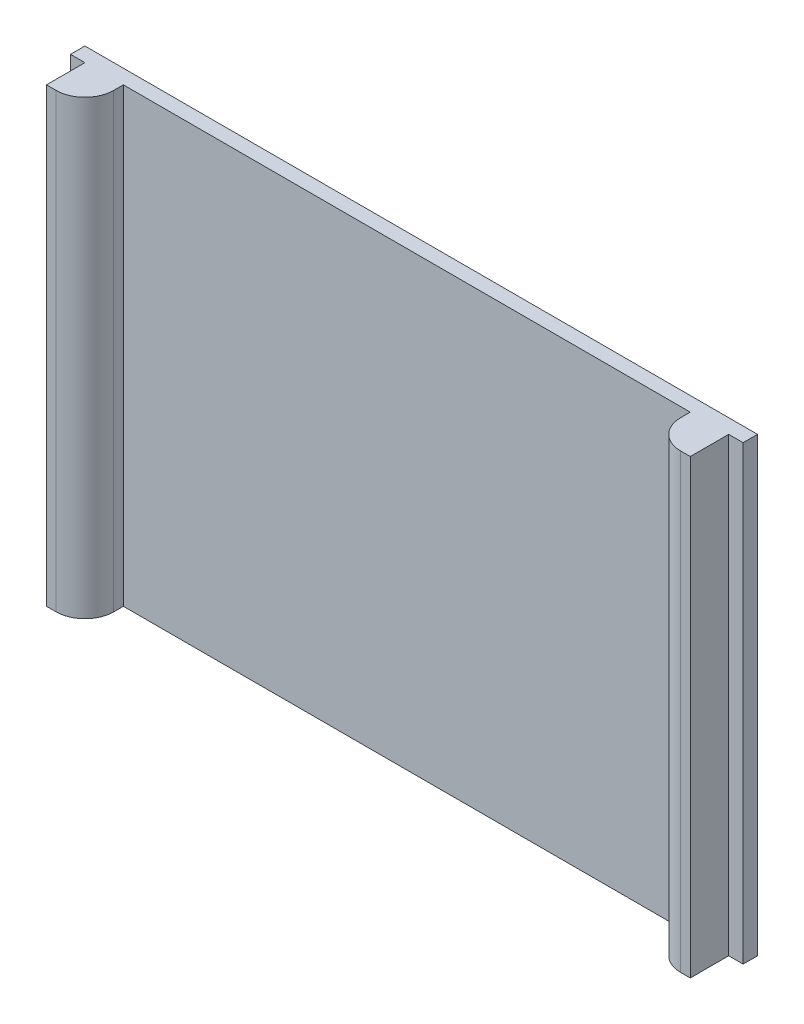
ISO-10303-21;
HEADER;
FILE_DESCRIPTION(('STEP AP214'),'2;1');
FILE_NAME('part.step','',(''),(''),'','','');
FILE_SCHEMA(('AUTOMOTIVE_DESIGN { 1 0 10303 214 1 1 1 1 }'));
ENDSEC;
DATA;
#1=APPLICATION_CONTEXT('core data for automotive mechanical design processes');
#2=APPLICATION_PROTOCOL_DEFINITION('international standard','automotive_design',2000,#1);
#3=PRODUCT_CONTEXT('',#1,'mechanical');
#4=PRODUCT('Part','Part','',(#3));
#5=PRODUCT_RELATED_PRODUCT_CATEGORY('part','',(#4));
#6=PRODUCT_DEFINITION_FORMATION('','',#4);
#7=PRODUCT_DEFINITION_CONTEXT('part definition',#1,'design');
#8=PRODUCT_DEFINITION('design','',#6,#7);
#9=PRODUCT_DEFINITION_SHAPE('','',#8);
#10=(LENGTH_UNIT() NAMED_UNIT(*) SI_UNIT(.MILLI.,.METRE.));
#11=(NAMED_UNIT(*) PLANE_ANGLE_UNIT() SI_UNIT($,.RADIAN.));
#12=(NAMED_UNIT(*) SI_UNIT($,.STERADIAN.) SOLID_ANGLE_UNIT());
#13=UNCERTAINTY_MEASURE_WITH_UNIT(LENGTH_MEASURE(1.E-05),#10,'distance_accuracy_value','');
#14=(GEOMETRIC_REPRESENTATION_CONTEXT(3) GLOBAL_UNCERTAINTY_ASSIGNED_CONTEXT((#13)) GLOBAL_UNIT_ASSIGNED_CONTEXT((#10,
#11,#12)) REPRESENTATION_CONTEXT('',''));
#15=CARTESIAN_POINT('',(0.,0.,0.));
#16=DIRECTION('',(0.,0.,1.));
#17=DIRECTION('',(1.,0.,0.));
#18=AXIS2_PLACEMENT_3D('',#15,#16,#17);
#19=CARTESIAN_POINT('',(0.,0.,15.));
#20=DIRECTION('',(0.,0.,-1.));
#21=DIRECTION('',(-1.,0.,0.));
#22=AXIS2_PLACEMENT_3D('',#19,#20,#21);
#23=PLANE('',#22);
#24=DIRECTION('',(-1.,0.,0.));
#25=VECTOR('',#24,1.);
#26=CARTESIAN_POINT('',(-350.,235.,15.));
#27=LINE('',#26,#25);
#28=CARTESIAN_POINT('',(350.,235.,15.));
#29=VERTEX_POINT('',#28);
#30=CARTESIAN_POINT('',(335.,235.,15.));
#31=VERTEX_POINT('',#30);
#32=EDGE_CURVE('E196',#29,#31,#27,.T.);
#33=ORIENTED_EDGE('',*,*,#32,.T.);
#34=DIRECTION('',(0.,-1.,0.));
#35=VECTOR('',#34,1.);
#36=CARTESIAN_POINT('',(335.,235.,15.));
#37=LINE('',#36,#35);
#38=CARTESIAN_POINT('',(335.,-235.,15.));
#39=VERTEX_POINT('',#38);
#40=EDGE_CURVE('E149',#31,#39,#37,.T.);
#41=ORIENTED_EDGE('',*,*,#40,.T.);
#42=DIRECTION('',(1.,0.,0.));
#43=VECTOR('',#42,1.);
#44=CARTESIAN_POINT('',(-350.,-235.,15.));
#45=LINE('',#44,#43);
#46=CARTESIAN_POINT('',(350.,-235.,15.));
#47=VERTEX_POINT('',#46);
#48=EDGE_CURVE('E201',#39,#47,#45,.T.);
#49=ORIENTED_EDGE('',*,*,#48,.T.);
#50=DIRECTION('',(0.,1.,0.));
#51=VECTOR('',#50,1.);
#52=CARTESIAN_POINT('',(350.,-235.,15.));
#53=LINE('',#52,#51);
#54=EDGE_CURVE('E191',#47,#29,#53,.T.);
#55=ORIENTED_EDGE('',*,*,#54,.T.);
#56=EDGE_LOOP('',(#33,#41,#49,#55));
#57=FACE_BOUND('',#56,.T.);
#58=ADVANCED_FACE('F37',(#57),#23,.F.);
#59=DIRECTION('',(0.,-1.,0.));
#60=VECTOR('',#59,1.);
#61=CARTESIAN_POINT('',(-335.,235.,15.));
#62=LINE('',#61,#60);
#63=CARTESIAN_POINT('',(-335.,235.,15.));
#64=VERTEX_POINT('',#63);
#65=CARTESIAN_POINT('',(-335.,-235.,15.));
#66=VERTEX_POINT('',#65);
#67=EDGE_CURVE('E150',#64,#66,#62,.T.);
#68=ORIENTED_EDGE('',*,*,#67,.F.);
#69=CARTESIAN_POINT('',(-350.,235.,15.));
#70=VERTEX_POINT('',#69);
#71=EDGE_CURVE('E194',#64,#70,#27,.T.);
#72=ORIENTED_EDGE('',*,*,#71,.T.);
#73=DIRECTION('',(0.,-1.,0.));
#74=VECTOR('',#73,1.);
#75=CARTESIAN_POINT('',(-350.,-235.,15.));
#76=LINE('',#75,#74);
#77=CARTESIAN_POINT('',(-350.,-235.,15.));
#78=VERTEX_POINT('',#77);
#79=EDGE_CURVE('E198',#70,#78,#76,.T.);
#80=ORIENTED_EDGE('',*,*,#79,.T.);
#81=EDGE_CURVE('E202',#78,#66,#45,.T.);
#82=ORIENTED_EDGE('',*,*,#81,.T.);
#83=EDGE_LOOP('',(#68,#72,#80,#82));
#84=FACE_BOUND('',#83,.T.);
#85=ADVANCED_FACE('F250',(#84),#23,.F.);
#86=CARTESIAN_POINT('',(-295.,-235.,15.));
#87=VERTEX_POINT('',#86);
#88=CARTESIAN_POINT('',(295.,-235.,15.));
#89=VERTEX_POINT('',#88);
#90=EDGE_CURVE('E205',#87,#89,#45,.T.);
#91=ORIENTED_EDGE('',*,*,#90,.T.);
#92=DIRECTION('',(0.,1.,0.));
#93=VECTOR('',#92,1.);
#94=CARTESIAN_POINT('',(295.,235.,15.));
#95=LINE('',#94,#93);
#96=CARTESIAN_POINT('',(295.,235.,15.));
#97=VERTEX_POINT('',#96);
#98=EDGE_CURVE('E154',#89,#97,#95,.T.);
#99=ORIENTED_EDGE('',*,*,#98,.T.);
#100=CARTESIAN_POINT('',(-295.,235.,15.));
#101=VERTEX_POINT('',#100);
#102=EDGE_CURVE('E199',#97,#101,#27,.T.);
#103=ORIENTED_EDGE('',*,*,#102,.T.);
#104=DIRECTION('',(0.,1.,0.));
#105=VECTOR('',#104,1.);
#106=CARTESIAN_POINT('',(-295.,235.,15.));
#107=LINE('',#106,#105);
#108=EDGE_CURVE('E170',#87,#101,#107,.T.);
#109=ORIENTED_EDGE('',*,*,#108,.F.);
#110=EDGE_LOOP('',(#91,#99,#103,#109));
#111=FACE_BOUND('',#110,.T.);
#112=ADVANCED_FACE('F297',(#111),#23,.F.);
#113=CARTESIAN_POINT('',(350.,-235.,15.));
#114=DIRECTION('',(-1.,0.,0.));
#115=DIRECTION('',(0.,0.,1.));
#116=AXIS2_PLACEMENT_3D('',#113,#114,#115);
#117=PLANE('',#116);
#118=DIRECTION('',(0.,1.,0.));
#119=VECTOR('',#118,1.);
#120=CARTESIAN_POINT('',(350.,-235.,0.));
#121=LINE('',#120,#119);
#122=CARTESIAN_POINT('',(350.,-235.,0.));
#123=VERTEX_POINT('',#122);
#124=CARTESIAN_POINT('',(350.,235.,0.));
#125=VERTEX_POINT('',#124);
#126=EDGE_CURVE('E190',#123,#125,#121,.T.);
#127=ORIENTED_EDGE('',*,*,#126,.T.);
#128=DIRECTION('',(0.,0.,-1.));
#129=VECTOR('',#128,1.);
#130=CARTESIAN_POINT('',(350.,235.,15.));
#131=LINE('',#130,#129);
#132=EDGE_CURVE('E221',#29,#125,#131,.T.);
#133=ORIENTED_EDGE('',*,*,#132,.F.);
#134=ORIENTED_EDGE('',*,*,#54,.F.);
#135=DIRECTION('',(0.,0.,-1.));
#136=VECTOR('',#135,1.);
#137=CARTESIAN_POINT('',(350.,-235.,15.));
#138=LINE('',#137,#136);
#139=EDGE_CURVE('E204',#47,#123,#138,.T.);
#140=ORIENTED_EDGE('',*,*,#139,.T.);
#141=EDGE_LOOP('',(#127,#133,#134,#140));
#142=FACE_BOUND('',#141,.T.);
#143=ADVANCED_FACE('F284',(#142),#117,.F.);
#144=CARTESIAN_POINT('',(-350.,235.,15.));
#145=DIRECTION('',(0.,-1.,0.));
#146=DIRECTION('',(0.,0.,-1.));
#147=AXIS2_PLACEMENT_3D('',#144,#145,#146);
#148=PLANE('',#147);
#149=DIRECTION('',(0.,0.,-1.));
#150=VECTOR('',#149,1.);
#151=CARTESIAN_POINT('',(295.,235.,55.));
#152=LINE('',#151,#150);
#153=CARTESIAN_POINT('',(295.,235.,25.));
#154=VERTEX_POINT('',#153);
#155=EDGE_CURVE('E151',#154,#97,#152,.T.);
#156=ORIENTED_EDGE('',*,*,#155,.F.);
#157=CARTESIAN_POINT('',(325.,235.,25.));
#158=DIRECTION('',(0.,-1.,0.));
#159=DIRECTION('',(0.,0.,-1.));
#160=AXIS2_PLACEMENT_3D('',#157,#158,#159);
#161=CIRCLE('',#160,30.);
#162=CARTESIAN_POINT('',(325.,235.,55.));
#163=VERTEX_POINT('',#162);
#164=EDGE_CURVE('E59',#154,#163,#161,.F.);
#165=ORIENTED_EDGE('',*,*,#164,.T.);
#166=DIRECTION('',(1.,0.,0.));
#167=VECTOR('',#166,1.);
#168=CARTESIAN_POINT('',(335.,235.,55.));
#169=LINE('',#168,#167);
#170=CARTESIAN_POINT('',(335.,235.,55.));
#171=VERTEX_POINT('',#170);
#172=EDGE_CURVE('E135',#163,#171,#169,.T.);
#173=ORIENTED_EDGE('',*,*,#172,.T.);
#174=DIRECTION('',(0.,0.,-1.));
#175=VECTOR('',#174,1.);
#176=CARTESIAN_POINT('',(335.,235.,55.));
#177=LINE('',#176,#175);
#178=EDGE_CURVE('E138',#171,#31,#177,.T.);
#179=ORIENTED_EDGE('',*,*,#178,.T.);
#180=ORIENTED_EDGE('',*,*,#32,.F.);
#181=ORIENTED_EDGE('',*,*,#132,.T.);
#182=DIRECTION('',(-1.,0.,0.));
#183=VECTOR('',#182,1.);
#184=CARTESIAN_POINT('',(-350.,235.,0.));
#185=LINE('',#184,#183);
#186=CARTESIAN_POINT('',(-350.,235.,0.));
#187=VERTEX_POINT('',#186);
#188=EDGE_CURVE('E208',#125,#187,#185,.T.);
#189=ORIENTED_EDGE('',*,*,#188,.T.);
#190=DIRECTION('',(0.,0.,-1.));
#191=VECTOR('',#190,1.);
#192=CARTESIAN_POINT('',(-350.,235.,15.));
#193=LINE('',#192,#191);
#194=EDGE_CURVE('E218',#70,#187,#193,.T.);
#195=ORIENTED_EDGE('',*,*,#194,.F.);
#196=ORIENTED_EDGE('',*,*,#71,.F.);
#197=DIRECTION('',(0.,0.,-1.));
#198=VECTOR('',#197,1.);
#199=CARTESIAN_POINT('',(-335.,235.,55.));
#200=LINE('',#199,#198);
#201=CARTESIAN_POINT('',(-335.,235.,55.));
#202=VERTEX_POINT('',#201);
#203=EDGE_CURVE('E175',#202,#64,#200,.T.);
#204=ORIENTED_EDGE('',*,*,#203,.F.);
#205=DIRECTION('',(-1.,0.,0.));
#206=VECTOR('',#205,1.);
#207=CARTESIAN_POINT('',(-335.,235.,55.));
#208=LINE('',#207,#206);
#209=CARTESIAN_POINT('',(-325.,235.,55.));
#210=VERTEX_POINT('',#209);
#211=EDGE_CURVE('E173',#210,#202,#208,.T.);
#212=ORIENTED_EDGE('',*,*,#211,.F.);
#213=CARTESIAN_POINT('',(-325.,235.,25.));
#214=DIRECTION('',(0.,-1.,0.));
#215=DIRECTION('',(0.,0.,-1.));
#216=AXIS2_PLACEMENT_3D('',#213,#214,#215);
#217=CIRCLE('',#216,30.);
#218=CARTESIAN_POINT('',(-295.,235.,25.));
#219=VERTEX_POINT('',#218);
#220=EDGE_CURVE('E227',#210,#219,#217,.F.);
#221=ORIENTED_EDGE('',*,*,#220,.T.);
#222=DIRECTION('',(0.,0.,-1.));
#223=VECTOR('',#222,1.);
#224=CARTESIAN_POINT('',(-295.,235.,55.));
#225=LINE('',#224,#223);
#226=EDGE_CURVE('E182',#219,#101,#225,.T.);
#227=ORIENTED_EDGE('',*,*,#226,.T.);
#228=ORIENTED_EDGE('',*,*,#102,.F.);
#229=EDGE_LOOP('',(#156,#165,#173,#179,#180,#181,#189,#195,#196,#204,#212,#221,#227,#228));
#230=FACE_BOUND('',#229,.T.);
#231=ADVANCED_FACE('F137',(#230),#148,.F.);
#232=CARTESIAN_POINT('',(-350.,-235.,15.));
#233=DIRECTION('',(1.,0.,0.));
#234=DIRECTION('',(0.,0.,-1.));
#235=AXIS2_PLACEMENT_3D('',#232,#233,#234);
#236=PLANE('',#235);
#237=DIRECTION('',(0.,-1.,0.));
#238=VECTOR('',#237,1.);
#239=CARTESIAN_POINT('',(-350.,-235.,0.));
#240=LINE('',#239,#238);
#241=CARTESIAN_POINT('',(-350.,-235.,0.));
#242=VERTEX_POINT('',#241);
#243=EDGE_CURVE('E210',#187,#242,#240,.T.);
#244=ORIENTED_EDGE('',*,*,#243,.T.);
#245=DIRECTION('',(0.,0.,-1.));
#246=VECTOR('',#245,1.);
#247=CARTESIAN_POINT('',(-350.,-235.,15.));
#248=LINE('',#247,#246);
#249=EDGE_CURVE('E215',#78,#242,#248,.T.);
#250=ORIENTED_EDGE('',*,*,#249,.F.);
#251=ORIENTED_EDGE('',*,*,#79,.F.);
#252=ORIENTED_EDGE('',*,*,#194,.T.);
#253=EDGE_LOOP('',(#244,#250,#251,#252));
#254=FACE_BOUND('',#253,.T.);
#255=ADVANCED_FACE('F256',(#254),#236,.F.);
#256=CARTESIAN_POINT('',(-350.,-235.,15.));
#257=DIRECTION('',(0.,1.,0.));
#258=DIRECTION('',(0.,0.,1.));
#259=AXIS2_PLACEMENT_3D('',#256,#257,#258);
#260=PLANE('',#259);
#261=DIRECTION('',(-1.,0.,0.));
#262=VECTOR('',#261,1.);
#263=CARTESIAN_POINT('',(335.,-235.,55.));
#264=LINE('',#263,#262);
#265=CARTESIAN_POINT('',(335.,-235.,55.));
#266=VERTEX_POINT('',#265);
#267=CARTESIAN_POINT('',(325.,-235.,55.));
#268=VERTEX_POINT('',#267);
#269=EDGE_CURVE('E141',#266,#268,#264,.T.);
#270=ORIENTED_EDGE('',*,*,#269,.T.);
#271=CARTESIAN_POINT('',(325.,-235.,25.));
#272=DIRECTION('',(0.,1.,0.));
#273=DIRECTION('',(0.,0.,1.));
#274=AXIS2_PLACEMENT_3D('',#271,#272,#273);
#275=CIRCLE('',#274,30.);
#276=CARTESIAN_POINT('',(295.,-235.,25.));
#277=VERTEX_POINT('',#276);
#278=EDGE_CURVE('E11',#268,#277,#275,.F.);
#279=ORIENTED_EDGE('',*,*,#278,.T.);
#280=DIRECTION('',(0.,0.,-1.));
#281=VECTOR('',#280,1.);
#282=CARTESIAN_POINT('',(295.,-235.,55.));
#283=LINE('',#282,#281);
#284=EDGE_CURVE('E163',#277,#89,#283,.T.);
#285=ORIENTED_EDGE('',*,*,#284,.T.);
#286=ORIENTED_EDGE('',*,*,#90,.F.);
#287=DIRECTION('',(0.,0.,-1.));
#288=VECTOR('',#287,1.);
#289=CARTESIAN_POINT('',(-295.,-235.,55.));
#290=LINE('',#289,#288);
#291=CARTESIAN_POINT('',(-295.,-235.,25.));
#292=VERTEX_POINT('',#291);
#293=EDGE_CURVE('E185',#292,#87,#290,.T.);
#294=ORIENTED_EDGE('',*,*,#293,.F.);
#295=CARTESIAN_POINT('',(-325.,-235.,25.));
#296=DIRECTION('',(0.,1.,0.));
#297=DIRECTION('',(0.,0.,1.));
#298=AXIS2_PLACEMENT_3D('',#295,#296,#297);
#299=CIRCLE('',#298,30.);
#300=CARTESIAN_POINT('',(-325.,-235.,55.));
#301=VERTEX_POINT('',#300);
#302=EDGE_CURVE('E231',#292,#301,#299,.F.);
#303=ORIENTED_EDGE('',*,*,#302,.T.);
#304=DIRECTION('',(1.,0.,0.));
#305=VECTOR('',#304,1.);
#306=CARTESIAN_POINT('',(-335.,-235.,55.));
#307=LINE('',#306,#305);
#308=CARTESIAN_POINT('',(-335.,-235.,55.));
#309=VERTEX_POINT('',#308);
#310=EDGE_CURVE('E169',#309,#301,#307,.T.);
#311=ORIENTED_EDGE('',*,*,#310,.F.);
#312=DIRECTION('',(0.,0.,-1.));
#313=VECTOR('',#312,1.);
#314=CARTESIAN_POINT('',(-335.,-235.,55.));
#315=LINE('',#314,#313);
#316=EDGE_CURVE('E187',#309,#66,#315,.T.);
#317=ORIENTED_EDGE('',*,*,#316,.T.);
#318=ORIENTED_EDGE('',*,*,#81,.F.);
#319=ORIENTED_EDGE('',*,*,#249,.T.);
#320=DIRECTION('',(1.,0.,0.));
#321=VECTOR('',#320,1.);
#322=CARTESIAN_POINT('',(-350.,-235.,0.));
#323=LINE('',#322,#321);
#324=EDGE_CURVE('E195',#242,#123,#323,.T.);
#325=ORIENTED_EDGE('',*,*,#324,.T.);
#326=ORIENTED_EDGE('',*,*,#139,.F.);
#327=ORIENTED_EDGE('',*,*,#48,.F.);
#328=DIRECTION('',(0.,0.,-1.));
#329=VECTOR('',#328,1.);
#330=CARTESIAN_POINT('',(335.,-235.,55.));
#331=LINE('',#330,#329);
#332=EDGE_CURVE('E160',#266,#39,#331,.T.);
#333=ORIENTED_EDGE('',*,*,#332,.F.);
#334=EDGE_LOOP('',(#270,#279,#285,#286,#294,#303,#311,#317,#318,#319,#325,#326,#327,#333));
#335=FACE_BOUND('',#334,.T.);
#336=ADVANCED_FACE('F260',(#335),#260,.F.);
#337=CARTESIAN_POINT('',(0.,0.,0.));
#338=DIRECTION('',(0.,0.,-1.));
#339=DIRECTION('',(-1.,0.,0.));
#340=AXIS2_PLACEMENT_3D('',#337,#338,#339);
#341=PLANE('',#340);
#342=ORIENTED_EDGE('',*,*,#126,.F.);
#343=ORIENTED_EDGE('',*,*,#324,.F.);
#344=ORIENTED_EDGE('',*,*,#243,.F.);
#345=ORIENTED_EDGE('',*,*,#188,.F.);
#346=EDGE_LOOP('',(#342,#343,#344,#345));
#347=FACE_BOUND('',#346,.T.);
#348=ADVANCED_FACE('F286',(#347),#341,.T.);
#349=CARTESIAN_POINT('',(-335.,235.,55.));
#350=DIRECTION('',(1.,0.,0.));
#351=DIRECTION('',(0.,0.,-1.));
#352=AXIS2_PLACEMENT_3D('',#349,#350,#351);
#353=PLANE('',#352);
#354=ORIENTED_EDGE('',*,*,#67,.T.);
#355=ORIENTED_EDGE('',*,*,#316,.F.);
#356=DIRECTION('',(0.,-1.,0.));
#357=VECTOR('',#356,1.);
#358=CARTESIAN_POINT('',(-335.,235.,55.));
#359=LINE('',#358,#357);
#360=EDGE_CURVE('E166',#202,#309,#359,.T.);
#361=ORIENTED_EDGE('',*,*,#360,.F.);
#362=ORIENTED_EDGE('',*,*,#203,.T.);
#363=EDGE_LOOP('',(#354,#355,#361,#362));
#364=FACE_BOUND('',#363,.T.);
#365=ADVANCED_FACE('F264',(#364),#353,.F.);
#366=CARTESIAN_POINT('',(-295.,235.,55.));
#367=DIRECTION('',(-1.,0.,0.));
#368=DIRECTION('',(0.,-1.,0.));
#369=AXIS2_PLACEMENT_3D('',#366,#367,#368);
#370=PLANE('',#369);
#371=ORIENTED_EDGE('',*,*,#226,.F.);
#372=DIRECTION('',(0.,1.,0.));
#373=VECTOR('',#372,1.);
#374=CARTESIAN_POINT('',(-295.,-235.,25.));
#375=LINE('',#374,#373);
#376=EDGE_CURVE('E229',#219,#292,#375,.F.);
#377=ORIENTED_EDGE('',*,*,#376,.T.);
#378=ORIENTED_EDGE('',*,*,#293,.T.);
#379=ORIENTED_EDGE('',*,*,#108,.T.);
#380=EDGE_LOOP('',(#371,#377,#378,#379));
#381=FACE_BOUND('',#380,.T.);
#382=ADVANCED_FACE('F275',(#381),#370,.F.);
#383=CARTESIAN_POINT('',(0.,0.,55.));
#384=DIRECTION('',(0.,0.,1.));
#385=DIRECTION('',(1.,0.,0.));
#386=AXIS2_PLACEMENT_3D('',#383,#384,#385);
#387=PLANE('',#386);
#388=ORIENTED_EDGE('',*,*,#310,.T.);
#389=DIRECTION('',(0.,1.,0.));
#390=VECTOR('',#389,1.);
#391=CARTESIAN_POINT('',(-325.,235.,55.));
#392=LINE('',#391,#390);
#393=EDGE_CURVE('E224',#301,#210,#392,.T.);
#394=ORIENTED_EDGE('',*,*,#393,.T.);
#395=ORIENTED_EDGE('',*,*,#211,.T.);
#396=ORIENTED_EDGE('',*,*,#360,.T.);
#397=EDGE_LOOP('',(#388,#394,#395,#396));
#398=FACE_BOUND('',#397,.T.);
#399=ADVANCED_FACE('F267',(#398),#387,.T.);
#400=CARTESIAN_POINT('',(-325.,0.,25.));
#401=DIRECTION('',(0.,-1.,0.));
#402=DIRECTION('',(1.,0.,0.));
#403=AXIS2_PLACEMENT_3D('',#400,#401,#402);
#404=CYLINDRICAL_SURFACE('',#403,30.);
#405=ORIENTED_EDGE('',*,*,#302,.F.);
#406=ORIENTED_EDGE('',*,*,#376,.F.);
#407=ORIENTED_EDGE('',*,*,#220,.F.);
#408=ORIENTED_EDGE('',*,*,#393,.F.);
#409=EDGE_LOOP('',(#405,#406,#407,#408));
#410=FACE_BOUND('',#409,.T.);
#411=ADVANCED_FACE('F271',(#410),#404,.T.);
#412=CARTESIAN_POINT('',(335.,235.,55.));
#413=DIRECTION('',(1.,0.,0.));
#414=DIRECTION('',(0.,0.,-1.));
#415=AXIS2_PLACEMENT_3D('',#412,#413,#414);
#416=PLANE('',#415);
#417=ORIENTED_EDGE('',*,*,#40,.F.);
#418=ORIENTED_EDGE('',*,*,#178,.F.);
#419=DIRECTION('',(0.,-1.,0.));
#420=VECTOR('',#419,1.);
#421=CARTESIAN_POINT('',(335.,235.,55.));
#422=LINE('',#421,#420);
#423=EDGE_CURVE('E142',#171,#266,#422,.T.);
#424=ORIENTED_EDGE('',*,*,#423,.T.);
#425=ORIENTED_EDGE('',*,*,#332,.T.);
#426=EDGE_LOOP('',(#417,#418,#424,#425));
#427=FACE_BOUND('',#426,.T.);
#428=ADVANCED_FACE('F146',(#427),#416,.T.);
#429=CARTESIAN_POINT('',(295.,235.,55.));
#430=DIRECTION('',(-1.,0.,0.));
#431=DIRECTION('',(0.,-1.,0.));
#432=AXIS2_PLACEMENT_3D('',#429,#430,#431);
#433=PLANE('',#432);
#434=ORIENTED_EDGE('',*,*,#284,.F.);
#435=DIRECTION('',(0.,1.,0.));
#436=VECTOR('',#435,1.);
#437=CARTESIAN_POINT('',(295.,235.,25.));
#438=LINE('',#437,#436);
#439=EDGE_CURVE('E233',#277,#154,#438,.T.);
#440=ORIENTED_EDGE('',*,*,#439,.T.);
#441=ORIENTED_EDGE('',*,*,#155,.T.);
#442=ORIENTED_EDGE('',*,*,#98,.F.);
#443=EDGE_LOOP('',(#434,#440,#441,#442));
#444=FACE_BOUND('',#443,.T.);
#445=ADVANCED_FACE('F239',(#444),#433,.T.);
#446=CARTESIAN_POINT('',(0.,0.,55.));
#447=DIRECTION('',(0.,0.,1.));
#448=DIRECTION('',(-1.,0.,0.));
#449=AXIS2_PLACEMENT_3D('',#446,#447,#448);
#450=PLANE('',#449);
#451=ORIENTED_EDGE('',*,*,#172,.F.);
#452=DIRECTION('',(0.,1.,0.));
#453=VECTOR('',#452,1.);
#454=CARTESIAN_POINT('',(325.,0.,55.));
#455=LINE('',#454,#453);
#456=EDGE_CURVE('E45',#163,#268,#455,.F.);
#457=ORIENTED_EDGE('',*,*,#456,.T.);
#458=ORIENTED_EDGE('',*,*,#269,.F.);
#459=ORIENTED_EDGE('',*,*,#423,.F.);
#460=EDGE_LOOP('',(#451,#457,#458,#459));
#461=FACE_BOUND('',#460,.T.);
#462=ADVANCED_FACE('F153',(#461),#450,.T.);
#463=CARTESIAN_POINT('',(325.,235.,25.));
#464=DIRECTION('',(0.,1.,0.));
#465=DIRECTION('',(-1.,0.,0.));
#466=AXIS2_PLACEMENT_3D('',#463,#464,#465);
#467=CYLINDRICAL_SURFACE('',#466,30.);
#468=ORIENTED_EDGE('',*,*,#278,.F.);
#469=ORIENTED_EDGE('',*,*,#456,.F.);
#470=ORIENTED_EDGE('',*,*,#164,.F.);
#471=ORIENTED_EDGE('',*,*,#439,.F.);
#472=EDGE_LOOP('',(#468,#469,#470,#471));
#473=FACE_BOUND('',#472,.T.);
#474=ADVANCED_FACE('F39',(#473),#467,.T.);
#475=CLOSED_SHELL('',(#58,#85,#112,#143,#231,#255,#336,#348,#365,#382,#399,#411,#428,#445,#462,#474));
#476=MANIFOLD_SOLID_BREP('B2',#475);
#477=ADVANCED_BREP_SHAPE_REPRESENTATION('',(#18,#476),#14);
#478=SHAPE_DEFINITION_REPRESENTATION(#9,#477);
ENDSEC;
END-ISO-10303-21;
